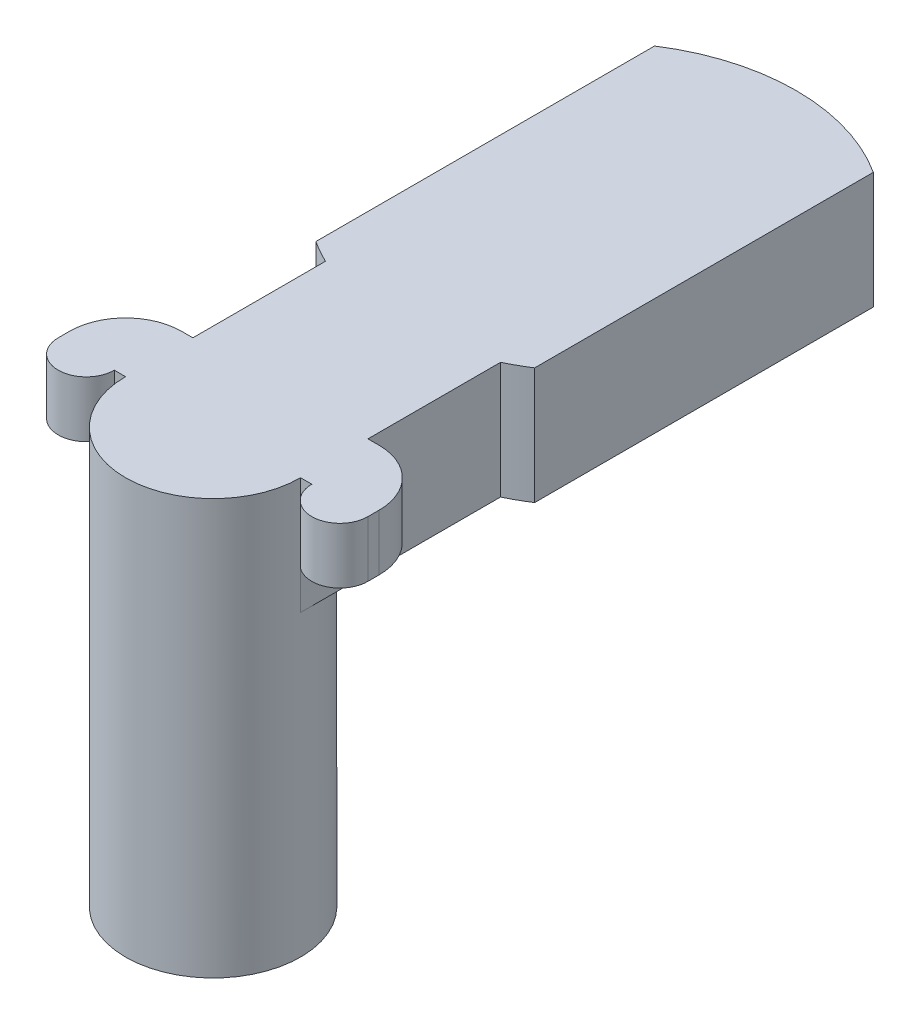
ISO-10303-21;
HEADER;
FILE_DESCRIPTION(('STEP AP214'),'2;1');
FILE_NAME('part.step','',(''),(''),'','','');
FILE_SCHEMA(('AUTOMOTIVE_DESIGN { 1 0 10303 214 1 1 1 1 }'));
ENDSEC;
DATA;
#1=APPLICATION_CONTEXT('core data for automotive mechanical design processes');
#2=APPLICATION_PROTOCOL_DEFINITION('international standard','automotive_design',2000,#1);
#3=PRODUCT_CONTEXT('',#1,'mechanical');
#4=PRODUCT('Part','Part','',(#3));
#5=PRODUCT_RELATED_PRODUCT_CATEGORY('part','',(#4));
#6=PRODUCT_DEFINITION_FORMATION('','',#4);
#7=PRODUCT_DEFINITION_CONTEXT('part definition',#1,'design');
#8=PRODUCT_DEFINITION('design','',#6,#7);
#9=PRODUCT_DEFINITION_SHAPE('','',#8);
#10=(LENGTH_UNIT() NAMED_UNIT(*) SI_UNIT(.MILLI.,.METRE.));
#11=(NAMED_UNIT(*) PLANE_ANGLE_UNIT() SI_UNIT($,.RADIAN.));
#12=(NAMED_UNIT(*) SI_UNIT($,.STERADIAN.) SOLID_ANGLE_UNIT());
#13=UNCERTAINTY_MEASURE_WITH_UNIT(LENGTH_MEASURE(1.E-05),#10,'distance_accuracy_value','');
#14=(GEOMETRIC_REPRESENTATION_CONTEXT(3) GLOBAL_UNCERTAINTY_ASSIGNED_CONTEXT((#13)) GLOBAL_UNIT_ASSIGNED_CONTEXT((#10,
#11,#12)) REPRESENTATION_CONTEXT('',''));
#15=CARTESIAN_POINT('',(0.,0.,0.));
#16=DIRECTION('',(0.,0.,1.));
#17=DIRECTION('',(1.,0.,0.));
#18=AXIS2_PLACEMENT_3D('',#15,#16,#17);
#19=CARTESIAN_POINT('',(3.9,0.,17.));
#20=DIRECTION('',(-1.,0.,0.));
#21=DIRECTION('',(0.,-1.,0.));
#22=AXIS2_PLACEMENT_3D('',#19,#20,#21);
#23=PLANE('',#22);
#24=DIRECTION('',(0.,1.,0.));
#25=VECTOR('',#24,1.);
#26=CARTESIAN_POINT('',(3.9,0.,14.000000000005));
#27=LINE('',#26,#25);
#28=CARTESIAN_POINT('',(3.9,2.7,14.000000000005));
#29=VERTEX_POINT('',#28);
#30=CARTESIAN_POINT('',(3.9,5.2,14.000000000005));
#31=VERTEX_POINT('',#30);
#32=EDGE_CURVE('E219',#29,#31,#27,.T.);
#33=ORIENTED_EDGE('',*,*,#32,.F.);
#34=DIRECTION('',(0.,0.,1.));
#35=VECTOR('',#34,1.);
#36=CARTESIAN_POINT('',(3.9,2.7,17.));
#37=LINE('',#36,#35);
#38=CARTESIAN_POINT('',(3.9,2.7,17.));
#39=VERTEX_POINT('',#38);
#40=EDGE_CURVE('E209',#29,#39,#37,.T.);
#41=ORIENTED_EDGE('',*,*,#40,.T.);
#42=DIRECTION('',(0.,1.,0.));
#43=VECTOR('',#42,1.);
#44=CARTESIAN_POINT('',(3.9,0.,17.));
#45=LINE('',#44,#43);
#46=CARTESIAN_POINT('',(3.9,0.,17.));
#47=VERTEX_POINT('',#46);
#48=EDGE_CURVE('E235',#47,#39,#45,.T.);
#49=ORIENTED_EDGE('',*,*,#48,.F.);
#50=DIRECTION('',(0.,0.,-1.));
#51=VECTOR('',#50,1.);
#52=CARTESIAN_POINT('',(3.9,0.,17.));
#53=LINE('',#52,#51);
#54=CARTESIAN_POINT('',(3.9,0.,8.09237102135974));
#55=VERTEX_POINT('',#54);
#56=EDGE_CURVE('E244',#47,#55,#53,.T.);
#57=ORIENTED_EDGE('',*,*,#56,.T.);
#58=DIRECTION('',(0.,-1.,0.));
#59=VECTOR('',#58,1.);
#60=CARTESIAN_POINT('',(3.9,5.2,8.09237102135974));
#61=LINE('',#60,#59);
#62=CARTESIAN_POINT('',(3.9,5.2,8.09237102135974));
#63=VERTEX_POINT('',#62);
#64=EDGE_CURVE('E261',#55,#63,#61,.F.);
#65=ORIENTED_EDGE('',*,*,#64,.T.);
#66=DIRECTION('',(0.,0.,-1.));
#67=VECTOR('',#66,1.);
#68=CARTESIAN_POINT('',(3.9,5.2,17.));
#69=LINE('',#68,#67);
#70=EDGE_CURVE('E69',#31,#63,#69,.T.);
#71=ORIENTED_EDGE('',*,*,#70,.F.);
#72=EDGE_LOOP('',(#33,#41,#49,#57,#65,#71));
#73=FACE_BOUND('',#72,.T.);
#74=ADVANCED_FACE('F45',(#73),#23,.F.);
#75=CARTESIAN_POINT('',(-3.9,0.,17.));
#76=DIRECTION('',(1.,0.,0.));
#77=DIRECTION('',(0.,1.,0.));
#78=AXIS2_PLACEMENT_3D('',#75,#76,#77);
#79=PLANE('',#78);
#80=DIRECTION('',(0.,-1.,0.));
#81=VECTOR('',#80,1.);
#82=CARTESIAN_POINT('',(-3.9,0.,14.000000000005));
#83=LINE('',#82,#81);
#84=CARTESIAN_POINT('',(-3.9,5.2,14.000000000005));
#85=VERTEX_POINT('',#84);
#86=CARTESIAN_POINT('',(-3.9,2.7,14.000000000005));
#87=VERTEX_POINT('',#86);
#88=EDGE_CURVE('E11',#85,#87,#83,.T.);
#89=ORIENTED_EDGE('',*,*,#88,.F.);
#90=DIRECTION('',(0.,0.,-1.));
#91=VECTOR('',#90,1.);
#92=CARTESIAN_POINT('',(-3.9,5.2,17.));
#93=LINE('',#92,#91);
#94=CARTESIAN_POINT('',(-3.9,5.2,8.09237102135974));
#95=VERTEX_POINT('',#94);
#96=EDGE_CURVE('E252',#85,#95,#93,.T.);
#97=ORIENTED_EDGE('',*,*,#96,.T.);
#98=DIRECTION('',(0.,-1.,0.));
#99=VECTOR('',#98,1.);
#100=CARTESIAN_POINT('',(-3.9,5.2,8.09237102135974));
#101=LINE('',#100,#99);
#102=CARTESIAN_POINT('',(-3.9,0.,8.09237102135974));
#103=VERTEX_POINT('',#102);
#104=EDGE_CURVE('E257',#95,#103,#101,.T.);
#105=ORIENTED_EDGE('',*,*,#104,.T.);
#106=DIRECTION('',(0.,0.,-1.));
#107=VECTOR('',#106,1.);
#108=CARTESIAN_POINT('',(-3.9,0.,17.));
#109=LINE('',#108,#107);
#110=CARTESIAN_POINT('',(-3.9,0.,17.));
#111=VERTEX_POINT('',#110);
#112=EDGE_CURVE('E248',#111,#103,#109,.T.);
#113=ORIENTED_EDGE('',*,*,#112,.F.);
#114=DIRECTION('',(0.,-1.,0.));
#115=VECTOR('',#114,1.);
#116=CARTESIAN_POINT('',(-3.9,0.,17.));
#117=LINE('',#116,#115);
#118=CARTESIAN_POINT('',(-3.9,2.7,17.));
#119=VERTEX_POINT('',#118);
#120=EDGE_CURVE('E239',#119,#111,#117,.T.);
#121=ORIENTED_EDGE('',*,*,#120,.F.);
#122=DIRECTION('',(0.,0.,-1.));
#123=VECTOR('',#122,1.);
#124=CARTESIAN_POINT('',(-3.9,2.7,17.));
#125=LINE('',#124,#123);
#126=EDGE_CURVE('E204',#119,#87,#125,.T.);
#127=ORIENTED_EDGE('',*,*,#126,.T.);
#128=EDGE_LOOP('',(#89,#97,#105,#113,#121,#127));
#129=FACE_BOUND('',#128,.T.);
#130=ADVANCED_FACE('F325',(#129),#79,.F.);
#131=CARTESIAN_POINT('',(0.,5.2,0.));
#132=DIRECTION('',(0.,-1.,0.));
#133=DIRECTION('',(0.,0.,-1.));
#134=AXIS2_PLACEMENT_3D('',#131,#132,#133);
#135=CYLINDRICAL_SURFACE('',#134,8.98312132542708);
#136=ORIENTED_EDGE('',*,*,#64,.F.);
#137=CARTESIAN_POINT('',(0.,0.,0.));
#138=DIRECTION('',(0.,1.,0.));
#139=DIRECTION('',(0.,0.,1.));
#140=AXIS2_PLACEMENT_3D('',#137,#138,#139);
#141=CIRCLE('',#140,8.98312132542708);
#142=CARTESIAN_POINT('',(4.875,0.,7.54525306052374));
#143=VERTEX_POINT('',#142);
#144=EDGE_CURVE('E289',#55,#143,#141,.T.);
#145=ORIENTED_EDGE('',*,*,#144,.T.);
#146=DIRECTION('',(0.,-1.,0.));
#147=VECTOR('',#146,1.);
#148=CARTESIAN_POINT('',(4.875,5.2,7.54525306052374));
#149=LINE('',#148,#147);
#150=CARTESIAN_POINT('',(4.875,5.2,7.54525306052374));
#151=VERTEX_POINT('',#150);
#152=EDGE_CURVE('E298',#151,#143,#149,.T.);
#153=ORIENTED_EDGE('',*,*,#152,.F.);
#154=CARTESIAN_POINT('',(0.,5.2,0.));
#155=DIRECTION('',(0.,1.,0.));
#156=DIRECTION('',(0.,0.,1.));
#157=AXIS2_PLACEMENT_3D('',#154,#155,#156);
#158=CIRCLE('',#157,8.98312132542708);
#159=EDGE_CURVE('E274',#63,#151,#158,.T.);
#160=ORIENTED_EDGE('',*,*,#159,.F.);
#161=EDGE_LOOP('',(#136,#145,#153,#160));
#162=FACE_BOUND('',#161,.T.);
#163=ADVANCED_FACE('F336',(#162),#135,.T.);
#164=ORIENTED_EDGE('',*,*,#104,.F.);
#165=CARTESIAN_POINT('',(-4.875,5.2,7.54525306052374));
#166=VERTEX_POINT('',#165);
#167=EDGE_CURVE('E275',#166,#95,#158,.T.);
#168=ORIENTED_EDGE('',*,*,#167,.F.);
#169=DIRECTION('',(0.,-1.,0.));
#170=VECTOR('',#169,1.);
#171=CARTESIAN_POINT('',(-4.875,5.2,7.54525306052374));
#172=LINE('',#171,#170);
#173=CARTESIAN_POINT('',(-4.875,0.,7.54525306052374));
#174=VERTEX_POINT('',#173);
#175=EDGE_CURVE('E302',#166,#174,#172,.T.);
#176=ORIENTED_EDGE('',*,*,#175,.T.);
#177=EDGE_CURVE('E290',#174,#103,#141,.T.);
#178=ORIENTED_EDGE('',*,*,#177,.T.);
#179=EDGE_LOOP('',(#164,#168,#176,#178));
#180=FACE_BOUND('',#179,.T.);
#181=ADVANCED_FACE('F322',(#180),#135,.T.);
#182=CARTESIAN_POINT('',(0.,5.2,0.));
#183=DIRECTION('',(0.,-1.,0.));
#184=DIRECTION('',(0.,0.,-1.));
#185=AXIS2_PLACEMENT_3D('',#182,#183,#184);
#186=CYLINDRICAL_SURFACE('',#185,8.98312132542708);
#187=CARTESIAN_POINT('',(0.,0.,0.));
#188=DIRECTION('',(0.,1.,0.));
#189=DIRECTION('',(0.,0.,1.));
#190=AXIS2_PLACEMENT_3D('',#187,#188,#189);
#191=CIRCLE('',#190,8.98312132542708);
#192=CARTESIAN_POINT('',(4.875,0.,-7.54525306052374));
#193=VERTEX_POINT('',#192);
#194=CARTESIAN_POINT('',(-4.875,0.,-7.54525306052374));
#195=VERTEX_POINT('',#194);
#196=EDGE_CURVE('E265',#193,#195,#191,.T.);
#197=ORIENTED_EDGE('',*,*,#196,.T.);
#198=DIRECTION('',(0.,-1.,0.));
#199=VECTOR('',#198,1.);
#200=CARTESIAN_POINT('',(-4.875,5.2,-7.54525306052374));
#201=LINE('',#200,#199);
#202=CARTESIAN_POINT('',(-4.875,5.2,-7.54525306052374));
#203=VERTEX_POINT('',#202);
#204=EDGE_CURVE('E54',#203,#195,#201,.T.);
#205=ORIENTED_EDGE('',*,*,#204,.F.);
#206=CARTESIAN_POINT('',(0.,5.2,0.));
#207=DIRECTION('',(0.,1.,0.));
#208=DIRECTION('',(0.,0.,1.));
#209=AXIS2_PLACEMENT_3D('',#206,#207,#208);
#210=CIRCLE('',#209,8.98312132542708);
#211=CARTESIAN_POINT('',(4.875,5.2,-7.54525306052374));
#212=VERTEX_POINT('',#211);
#213=EDGE_CURVE('E266',#212,#203,#210,.T.);
#214=ORIENTED_EDGE('',*,*,#213,.F.);
#215=DIRECTION('',(0.,-1.,0.));
#216=VECTOR('',#215,1.);
#217=CARTESIAN_POINT('',(4.875,5.2,-7.54525306052374));
#218=LINE('',#217,#216);
#219=EDGE_CURVE('E282',#212,#193,#218,.T.);
#220=ORIENTED_EDGE('',*,*,#219,.T.);
#221=EDGE_LOOP('',(#197,#205,#214,#220));
#222=FACE_BOUND('',#221,.T.);
#223=ADVANCED_FACE('F47',(#222),#186,.T.);
#224=CARTESIAN_POINT('',(-4.875,5.2,-7.54525306052374));
#225=DIRECTION('',(1.,0.,0.));
#226=DIRECTION('',(0.,0.,-1.));
#227=AXIS2_PLACEMENT_3D('',#224,#225,#226);
#228=PLANE('',#227);
#229=DIRECTION('',(0.,0.,1.));
#230=VECTOR('',#229,1.);
#231=CARTESIAN_POINT('',(-4.875,0.,-7.54525306052374));
#232=LINE('',#231,#230);
#233=EDGE_CURVE('E286',#195,#174,#232,.T.);
#234=ORIENTED_EDGE('',*,*,#233,.T.);
#235=ORIENTED_EDGE('',*,*,#175,.F.);
#236=DIRECTION('',(0.,0.,1.));
#237=VECTOR('',#236,1.);
#238=CARTESIAN_POINT('',(-4.875,5.2,-7.54525306052374));
#239=LINE('',#238,#237);
#240=EDGE_CURVE('E270',#203,#166,#239,.T.);
#241=ORIENTED_EDGE('',*,*,#240,.F.);
#242=ORIENTED_EDGE('',*,*,#204,.T.);
#243=EDGE_LOOP('',(#234,#235,#241,#242));
#244=FACE_BOUND('',#243,.T.);
#245=ADVANCED_FACE('F309',(#244),#228,.F.);
#246=CARTESIAN_POINT('',(4.875,5.2,-7.54525306052374));
#247=DIRECTION('',(-1.,0.,0.));
#248=DIRECTION('',(0.,0.,1.));
#249=AXIS2_PLACEMENT_3D('',#246,#247,#248);
#250=PLANE('',#249);
#251=DIRECTION('',(0.,0.,-1.));
#252=VECTOR('',#251,1.);
#253=CARTESIAN_POINT('',(4.875,0.,-7.54525306052374));
#254=LINE('',#253,#252);
#255=EDGE_CURVE('E271',#143,#193,#254,.T.);
#256=ORIENTED_EDGE('',*,*,#255,.T.);
#257=ORIENTED_EDGE('',*,*,#219,.F.);
#258=DIRECTION('',(0.,0.,-1.));
#259=VECTOR('',#258,1.);
#260=CARTESIAN_POINT('',(4.875,5.2,-7.54525306052374));
#261=LINE('',#260,#259);
#262=EDGE_CURVE('E279',#151,#212,#261,.T.);
#263=ORIENTED_EDGE('',*,*,#262,.F.);
#264=ORIENTED_EDGE('',*,*,#152,.T.);
#265=EDGE_LOOP('',(#256,#257,#263,#264));
#266=FACE_BOUND('',#265,.T.);
#267=ADVANCED_FACE('F333',(#266),#250,.F.);
#268=CARTESIAN_POINT('',(0.,5.2,0.));
#269=DIRECTION('',(0.,1.,0.));
#270=DIRECTION('',(0.,0.,1.));
#271=AXIS2_PLACEMENT_3D('',#268,#269,#270);
#272=PLANE('',#271);
#273=CARTESIAN_POINT('',(0.,5.2,17.));
#274=DIRECTION('',(0.,1.,0.));
#275=DIRECTION('',(0.,0.,1.));
#276=AXIS2_PLACEMENT_3D('',#273,#274,#275);
#277=CIRCLE('',#276,3.9);
#278=CARTESIAN_POINT('',(-3.9,5.2,17.));
#279=VERTEX_POINT('',#278);
#280=CARTESIAN_POINT('',(3.9,5.2,17.));
#281=VERTEX_POINT('',#280);
#282=EDGE_CURVE('E222',#279,#281,#277,.T.);
#283=ORIENTED_EDGE('',*,*,#282,.T.);
#284=DIRECTION('',(1.,0.,0.));
#285=VECTOR('',#284,1.);
#286=CARTESIAN_POINT('',(-4.4,5.2,17.));
#287=LINE('',#286,#285);
#288=CARTESIAN_POINT('',(4.4,5.2,17.));
#289=VERTEX_POINT('',#288);
#290=EDGE_CURVE('E350',#281,#289,#287,.T.);
#291=ORIENTED_EDGE('',*,*,#290,.T.);
#292=CARTESIAN_POINT('',(5.65,5.2,17.));
#293=DIRECTION('',(0.,1.,0.));
#294=DIRECTION('',(0.,0.,1.));
#295=AXIS2_PLACEMENT_3D('',#292,#293,#294);
#296=CIRCLE('',#295,1.25);
#297=CARTESIAN_POINT('',(6.9,5.2,17.));
#298=VERTEX_POINT('',#297);
#299=EDGE_CURVE('E363',#289,#298,#296,.T.);
#300=ORIENTED_EDGE('',*,*,#299,.T.);
#301=DIRECTION('',(0.,0.,1.));
#302=VECTOR('',#301,1.);
#303=CARTESIAN_POINT('',(6.9,5.2,16.500000000005));
#304=LINE('',#303,#302);
#305=CARTESIAN_POINT('',(6.9,5.2,16.500000000005));
#306=VERTEX_POINT('',#305);
#307=EDGE_CURVE('E392',#306,#298,#304,.T.);
#308=ORIENTED_EDGE('',*,*,#307,.F.);
#309=CARTESIAN_POINT('',(4.4,5.2,16.500000000005));
#310=DIRECTION('',(0.,-1.,0.));
#311=DIRECTION('',(0.,0.,-1.));
#312=AXIS2_PLACEMENT_3D('',#309,#310,#311);
#313=CIRCLE('',#312,2.5);
#314=CARTESIAN_POINT('',(4.4,5.2,14.000000000005));
#315=VERTEX_POINT('',#314);
#316=EDGE_CURVE('E397',#315,#306,#313,.T.);
#317=ORIENTED_EDGE('',*,*,#316,.F.);
#318=DIRECTION('',(1.,0.,0.));
#319=VECTOR('',#318,1.);
#320=CARTESIAN_POINT('',(-4.4,5.2,14.000000000005));
#321=LINE('',#320,#319);
#322=EDGE_CURVE('E406',#31,#315,#321,.T.);
#323=ORIENTED_EDGE('',*,*,#322,.F.);
#324=ORIENTED_EDGE('',*,*,#70,.T.);
#325=ORIENTED_EDGE('',*,*,#159,.T.);
#326=ORIENTED_EDGE('',*,*,#262,.T.);
#327=ORIENTED_EDGE('',*,*,#213,.T.);
#328=ORIENTED_EDGE('',*,*,#240,.T.);
#329=ORIENTED_EDGE('',*,*,#167,.T.);
#330=ORIENTED_EDGE('',*,*,#96,.F.);
#331=CARTESIAN_POINT('',(-4.4,5.2,14.000000000005));
#332=VERTEX_POINT('',#331);
#333=EDGE_CURVE('E329',#332,#85,#321,.T.);
#334=ORIENTED_EDGE('',*,*,#333,.F.);
#335=CARTESIAN_POINT('',(-4.4,5.2,16.500000000005));
#336=DIRECTION('',(0.,-1.,0.));
#337=DIRECTION('',(0.,0.,-1.));
#338=AXIS2_PLACEMENT_3D('',#335,#336,#337);
#339=CIRCLE('',#338,2.5);
#340=CARTESIAN_POINT('',(-6.9,5.2,16.500000000005));
#341=VERTEX_POINT('',#340);
#342=EDGE_CURVE('E202',#341,#332,#339,.T.);
#343=ORIENTED_EDGE('',*,*,#342,.F.);
#344=DIRECTION('',(0.,0.,1.));
#345=VECTOR('',#344,1.);
#346=CARTESIAN_POINT('',(-6.9,5.2,16.500000000005));
#347=LINE('',#346,#345);
#348=CARTESIAN_POINT('',(-6.9,5.2,17.));
#349=VERTEX_POINT('',#348);
#350=EDGE_CURVE('E198',#341,#349,#347,.T.);
#351=ORIENTED_EDGE('',*,*,#350,.T.);
#352=CARTESIAN_POINT('',(-5.65,5.2,17.));
#353=DIRECTION('',(0.,-1.,0.));
#354=DIRECTION('',(0.,0.,-1.));
#355=AXIS2_PLACEMENT_3D('',#352,#353,#354);
#356=CIRCLE('',#355,1.25);
#357=CARTESIAN_POINT('',(-4.4,5.2,17.));
#358=VERTEX_POINT('',#357);
#359=EDGE_CURVE('E357',#358,#349,#356,.T.);
#360=ORIENTED_EDGE('',*,*,#359,.F.);
#361=EDGE_CURVE('E354',#358,#279,#287,.T.);
#362=ORIENTED_EDGE('',*,*,#361,.T.);
#363=EDGE_LOOP('',(#283,#291,#300,#308,#317,#323,#324,#325,#326,#327,#328,#329,#330,#334,#343,
#351,#360,#362));
#364=FACE_BOUND('',#363,.T.);
#365=ADVANCED_FACE('F328',(#364),#272,.T.);
#366=CARTESIAN_POINT('',(0.,0.,0.));
#367=DIRECTION('',(0.,1.,0.));
#368=DIRECTION('',(0.,0.,1.));
#369=AXIS2_PLACEMENT_3D('',#366,#367,#368);
#370=PLANE('',#369);
#371=ORIENTED_EDGE('',*,*,#56,.F.);
#372=CARTESIAN_POINT('',(0.,0.,17.));
#373=DIRECTION('',(0.,1.,0.));
#374=DIRECTION('',(0.,0.,1.));
#375=AXIS2_PLACEMENT_3D('',#372,#373,#374);
#376=CIRCLE('',#375,3.9);
#377=EDGE_CURVE('E227',#47,#111,#376,.T.);
#378=ORIENTED_EDGE('',*,*,#377,.T.);
#379=ORIENTED_EDGE('',*,*,#112,.T.);
#380=ORIENTED_EDGE('',*,*,#177,.F.);
#381=ORIENTED_EDGE('',*,*,#233,.F.);
#382=ORIENTED_EDGE('',*,*,#196,.F.);
#383=ORIENTED_EDGE('',*,*,#255,.F.);
#384=ORIENTED_EDGE('',*,*,#144,.F.);
#385=EDGE_LOOP('',(#371,#378,#379,#380,#381,#382,#383,#384));
#386=FACE_BOUND('',#385,.T.);
#387=ADVANCED_FACE('F317',(#386),#370,.F.);
#388=CARTESIAN_POINT('',(0.,-13.3,17.));
#389=DIRECTION('',(0.,1.,0.));
#390=DIRECTION('',(0.,0.,1.));
#391=AXIS2_PLACEMENT_3D('',#388,#389,#390);
#392=CYLINDRICAL_SURFACE('',#391,3.9);
#393=CARTESIAN_POINT('',(0.,-13.3,17.));
#394=DIRECTION('',(0.,1.,0.));
#395=DIRECTION('',(0.,0.,1.));
#396=AXIS2_PLACEMENT_3D('',#393,#394,#395);
#397=CIRCLE('',#396,3.9);
#398=CARTESIAN_POINT('',(0.,-13.3,20.9));
#399=VERTEX_POINT('',#398);
#400=EDGE_CURVE('E223',#399,#399,#397,.T.);
#401=ORIENTED_EDGE('',*,*,#400,.T.);
#402=EDGE_LOOP('',(#401));
#403=FACE_BOUND('',#402,.T.);
#404=EDGE_CURVE('E240',#279,#119,#117,.T.);
#405=ORIENTED_EDGE('',*,*,#404,.T.);
#406=ORIENTED_EDGE('',*,*,#120,.T.);
#407=ORIENTED_EDGE('',*,*,#377,.F.);
#408=ORIENTED_EDGE('',*,*,#48,.T.);
#409=EDGE_CURVE('E234',#39,#281,#45,.T.);
#410=ORIENTED_EDGE('',*,*,#409,.T.);
#411=ORIENTED_EDGE('',*,*,#282,.F.);
#412=EDGE_LOOP('',(#405,#406,#407,#408,#410,#411));
#413=FACE_BOUND('',#412,.T.);
#414=ADVANCED_FACE('F343',(#403,#413),#392,.T.);
#415=CARTESIAN_POINT('',(0.,-13.3,17.));
#416=DIRECTION('',(0.,1.,0.));
#417=DIRECTION('',(0.,0.,1.));
#418=AXIS2_PLACEMENT_3D('',#415,#416,#417);
#419=PLANE('',#418);
#420=CARTESIAN_POINT('',(0.,-13.3,17.));
#421=DIRECTION('',(0.,-1.,0.));
#422=DIRECTION('',(0.,0.,-1.));
#423=AXIS2_PLACEMENT_3D('',#420,#421,#422);
#424=CIRCLE('',#423,1.6);
#425=CARTESIAN_POINT('',(0.,-13.3,15.4));
#426=VERTEX_POINT('',#425);
#427=EDGE_CURVE('E426',#426,#426,#424,.T.);
#428=ORIENTED_EDGE('',*,*,#427,.F.);
#429=EDGE_LOOP('',(#428));
#430=FACE_BOUND('',#429,.T.);
#431=ORIENTED_EDGE('',*,*,#400,.F.);
#432=EDGE_LOOP('',(#431));
#433=FACE_BOUND('',#432,.T.);
#434=ADVANCED_FACE('F443',(#430,#433),#419,.F.);
#435=CARTESIAN_POINT('',(-6.9,2.7,16.500000000005));
#436=DIRECTION('',(-1.,0.,0.));
#437=DIRECTION('',(0.,0.,1.));
#438=AXIS2_PLACEMENT_3D('',#435,#436,#437);
#439=PLANE('',#438);
#440=ORIENTED_EDGE('',*,*,#350,.F.);
#441=DIRECTION('',(0.,1.,0.));
#442=VECTOR('',#441,1.);
#443=CARTESIAN_POINT('',(-6.9,2.7,16.500000000005));
#444=LINE('',#443,#442);
#445=CARTESIAN_POINT('',(-6.9,2.7,16.500000000005));
#446=VERTEX_POINT('',#445);
#447=EDGE_CURVE('E369',#446,#341,#444,.T.);
#448=ORIENTED_EDGE('',*,*,#447,.F.);
#449=DIRECTION('',(0.,0.,1.));
#450=VECTOR('',#449,1.);
#451=CARTESIAN_POINT('',(-6.9,2.7,16.500000000005));
#452=LINE('',#451,#450);
#453=CARTESIAN_POINT('',(-6.9,2.7,17.));
#454=VERTEX_POINT('',#453);
#455=EDGE_CURVE('E195',#446,#454,#452,.T.);
#456=ORIENTED_EDGE('',*,*,#455,.T.);
#457=DIRECTION('',(0.,1.,0.));
#458=VECTOR('',#457,1.);
#459=CARTESIAN_POINT('',(-6.9,2.7,17.));
#460=LINE('',#459,#458);
#461=EDGE_CURVE('E372',#454,#349,#460,.T.);
#462=ORIENTED_EDGE('',*,*,#461,.T.);
#463=EDGE_LOOP('',(#440,#448,#456,#462));
#464=FACE_BOUND('',#463,.T.);
#465=ADVANCED_FACE('F446',(#464),#439,.T.);
#466=CARTESIAN_POINT('',(-4.4,2.7,16.500000000005));
#467=DIRECTION('',(0.,1.,0.));
#468=DIRECTION('',(0.,0.,1.));
#469=AXIS2_PLACEMENT_3D('',#466,#467,#468);
#470=CYLINDRICAL_SURFACE('',#469,2.5);
#471=ORIENTED_EDGE('',*,*,#342,.T.);
#472=DIRECTION('',(0.,1.,0.));
#473=VECTOR('',#472,1.);
#474=CARTESIAN_POINT('',(-4.4,2.7,14.000000000005));
#475=LINE('',#474,#473);
#476=CARTESIAN_POINT('',(-4.4,2.7,14.000000000005));
#477=VERTEX_POINT('',#476);
#478=EDGE_CURVE('E181',#477,#332,#475,.T.);
#479=ORIENTED_EDGE('',*,*,#478,.F.);
#480=CARTESIAN_POINT('',(-4.4,2.7,16.500000000005));
#481=DIRECTION('',(0.,-1.,0.));
#482=DIRECTION('',(0.,0.,-1.));
#483=AXIS2_PLACEMENT_3D('',#480,#481,#482);
#484=CIRCLE('',#483,2.5);
#485=EDGE_CURVE('E192',#446,#477,#484,.T.);
#486=ORIENTED_EDGE('',*,*,#485,.F.);
#487=ORIENTED_EDGE('',*,*,#447,.T.);
#488=EDGE_LOOP('',(#471,#479,#486,#487));
#489=FACE_BOUND('',#488,.T.);
#490=ADVANCED_FACE('F200',(#489),#470,.T.);
#491=CARTESIAN_POINT('',(-5.65,2.7,17.));
#492=DIRECTION('',(0.,1.,0.));
#493=DIRECTION('',(0.,0.,1.));
#494=AXIS2_PLACEMENT_3D('',#491,#492,#493);
#495=CYLINDRICAL_SURFACE('',#494,1.25);
#496=ORIENTED_EDGE('',*,*,#359,.T.);
#497=ORIENTED_EDGE('',*,*,#461,.F.);
#498=CARTESIAN_POINT('',(-5.65,2.7,17.));
#499=DIRECTION('',(0.,-1.,0.));
#500=DIRECTION('',(0.,0.,-1.));
#501=AXIS2_PLACEMENT_3D('',#498,#499,#500);
#502=CIRCLE('',#501,1.25);
#503=CARTESIAN_POINT('',(-4.4,2.7,17.));
#504=VERTEX_POINT('',#503);
#505=EDGE_CURVE('E412',#504,#454,#502,.T.);
#506=ORIENTED_EDGE('',*,*,#505,.F.);
#507=DIRECTION('',(0.,1.,0.));
#508=VECTOR('',#507,1.);
#509=CARTESIAN_POINT('',(-4.4,2.7,17.));
#510=LINE('',#509,#508);
#511=EDGE_CURVE('E375',#504,#358,#510,.T.);
#512=ORIENTED_EDGE('',*,*,#511,.T.);
#513=EDGE_LOOP('',(#496,#497,#506,#512));
#514=FACE_BOUND('',#513,.T.);
#515=ADVANCED_FACE('F535',(#514),#495,.T.);
#516=CARTESIAN_POINT('',(-4.4,2.7,17.));
#517=DIRECTION('',(0.,0.,1.));
#518=DIRECTION('',(1.,0.,0.));
#519=AXIS2_PLACEMENT_3D('',#516,#517,#518);
#520=PLANE('',#519);
#521=DIRECTION('',(1.,0.,0.));
#522=VECTOR('',#521,1.);
#523=CARTESIAN_POINT('',(-4.4,2.7,17.));
#524=LINE('',#523,#522);
#525=EDGE_CURVE('E61',#504,#119,#524,.T.);
#526=ORIENTED_EDGE('',*,*,#525,.T.);
#527=ORIENTED_EDGE('',*,*,#404,.F.);
#528=ORIENTED_EDGE('',*,*,#361,.F.);
#529=ORIENTED_EDGE('',*,*,#511,.F.);
#530=EDGE_LOOP('',(#526,#527,#528,#529));
#531=FACE_BOUND('',#530,.T.);
#532=ADVANCED_FACE('F543',(#531),#520,.T.);
#533=CARTESIAN_POINT('',(-4.4,2.7,16.500000000005));
#534=DIRECTION('',(0.,-1.,0.));
#535=DIRECTION('',(0.,0.,-1.));
#536=AXIS2_PLACEMENT_3D('',#533,#534,#535);
#537=PLANE('',#536);
#538=ORIENTED_EDGE('',*,*,#126,.F.);
#539=ORIENTED_EDGE('',*,*,#525,.F.);
#540=ORIENTED_EDGE('',*,*,#505,.T.);
#541=ORIENTED_EDGE('',*,*,#455,.F.);
#542=ORIENTED_EDGE('',*,*,#485,.T.);
#543=DIRECTION('',(1.,0.,0.));
#544=VECTOR('',#543,1.);
#545=CARTESIAN_POINT('',(-4.4,2.7,14.000000000005));
#546=LINE('',#545,#544);
#547=EDGE_CURVE('E177',#477,#87,#546,.T.);
#548=ORIENTED_EDGE('',*,*,#547,.T.);
#549=EDGE_LOOP('',(#538,#539,#540,#541,#542,#548));
#550=FACE_BOUND('',#549,.T.);
#551=ADVANCED_FACE('F193',(#550),#537,.T.);
#552=CARTESIAN_POINT('',(-4.4,2.7,14.000000000005));
#553=DIRECTION('',(0.,0.,1.));
#554=DIRECTION('',(1.,0.,0.));
#555=AXIS2_PLACEMENT_3D('',#552,#553,#554);
#556=PLANE('',#555);
#557=ORIENTED_EDGE('',*,*,#333,.T.);
#558=ORIENTED_EDGE('',*,*,#88,.T.);
#559=ORIENTED_EDGE('',*,*,#547,.F.);
#560=ORIENTED_EDGE('',*,*,#478,.T.);
#561=EDGE_LOOP('',(#557,#558,#559,#560));
#562=FACE_BOUND('',#561,.T.);
#563=ADVANCED_FACE('F179',(#562),#556,.F.);
#564=CARTESIAN_POINT('',(4.4,2.7,14.000000000005));
#565=VERTEX_POINT('',#564);
#566=EDGE_CURVE('E188',#29,#565,#546,.T.);
#567=ORIENTED_EDGE('',*,*,#566,.F.);
#568=ORIENTED_EDGE('',*,*,#32,.T.);
#569=ORIENTED_EDGE('',*,*,#322,.T.);
#570=DIRECTION('',(0.,1.,0.));
#571=VECTOR('',#570,1.);
#572=CARTESIAN_POINT('',(4.4,2.7,14.000000000005));
#573=LINE('',#572,#571);
#574=EDGE_CURVE('E205',#565,#315,#573,.T.);
#575=ORIENTED_EDGE('',*,*,#574,.F.);
#576=EDGE_LOOP('',(#567,#568,#569,#575));
#577=FACE_BOUND('',#576,.T.);
#578=ADVANCED_FACE('F568',(#577),#556,.F.);
#579=ORIENTED_EDGE('',*,*,#290,.F.);
#580=ORIENTED_EDGE('',*,*,#409,.F.);
#581=CARTESIAN_POINT('',(4.4,2.7,17.));
#582=VERTEX_POINT('',#581);
#583=EDGE_CURVE('E417',#39,#582,#524,.T.);
#584=ORIENTED_EDGE('',*,*,#583,.T.);
#585=DIRECTION('',(0.,1.,0.));
#586=VECTOR('',#585,1.);
#587=CARTESIAN_POINT('',(4.4,2.7,17.));
#588=LINE('',#587,#586);
#589=EDGE_CURVE('E378',#582,#289,#588,.T.);
#590=ORIENTED_EDGE('',*,*,#589,.T.);
#591=EDGE_LOOP('',(#579,#580,#584,#590));
#592=FACE_BOUND('',#591,.T.);
#593=ADVANCED_FACE('F553',(#592),#520,.T.);
#594=ORIENTED_EDGE('',*,*,#40,.F.);
#595=ORIENTED_EDGE('',*,*,#566,.T.);
#596=CARTESIAN_POINT('',(4.4,2.7,16.500000000005));
#597=DIRECTION('',(0.,-1.,0.));
#598=DIRECTION('',(0.,0.,-1.));
#599=AXIS2_PLACEMENT_3D('',#596,#597,#598);
#600=CIRCLE('',#599,2.5);
#601=CARTESIAN_POINT('',(6.9,2.7,16.500000000005));
#602=VERTEX_POINT('',#601);
#603=EDGE_CURVE('E187',#565,#602,#600,.T.);
#604=ORIENTED_EDGE('',*,*,#603,.T.);
#605=DIRECTION('',(0.,0.,1.));
#606=VECTOR('',#605,1.);
#607=CARTESIAN_POINT('',(6.9,2.7,16.500000000005));
#608=LINE('',#607,#606);
#609=CARTESIAN_POINT('',(6.9,2.7,17.));
#610=VERTEX_POINT('',#609);
#611=EDGE_CURVE('E393',#602,#610,#608,.T.);
#612=ORIENTED_EDGE('',*,*,#611,.T.);
#613=CARTESIAN_POINT('',(5.65,2.7,17.));
#614=DIRECTION('',(0.,1.,0.));
#615=DIRECTION('',(0.,0.,1.));
#616=AXIS2_PLACEMENT_3D('',#613,#614,#615);
#617=CIRCLE('',#616,1.25);
#618=EDGE_CURVE('E418',#582,#610,#617,.T.);
#619=ORIENTED_EDGE('',*,*,#618,.F.);
#620=ORIENTED_EDGE('',*,*,#583,.F.);
#621=EDGE_LOOP('',(#594,#595,#604,#612,#619,#620));
#622=FACE_BOUND('',#621,.T.);
#623=ADVANCED_FACE('F561',(#622),#537,.T.);
#624=CARTESIAN_POINT('',(4.4,2.7,16.500000000005));
#625=DIRECTION('',(0.,1.,0.));
#626=DIRECTION('',(0.,0.,1.));
#627=AXIS2_PLACEMENT_3D('',#624,#625,#626);
#628=CYLINDRICAL_SURFACE('',#627,2.5);
#629=ORIENTED_EDGE('',*,*,#316,.T.);
#630=DIRECTION('',(0.,1.,0.));
#631=VECTOR('',#630,1.);
#632=CARTESIAN_POINT('',(6.9,2.7,16.500000000005));
#633=LINE('',#632,#631);
#634=EDGE_CURVE('E212',#602,#306,#633,.T.);
#635=ORIENTED_EDGE('',*,*,#634,.F.);
#636=ORIENTED_EDGE('',*,*,#603,.F.);
#637=ORIENTED_EDGE('',*,*,#574,.T.);
#638=EDGE_LOOP('',(#629,#635,#636,#637));
#639=FACE_BOUND('',#638,.T.);
#640=ADVANCED_FACE('F589',(#639),#628,.T.);
#641=CARTESIAN_POINT('',(6.9,2.7,16.500000000005));
#642=DIRECTION('',(-1.,0.,0.));
#643=DIRECTION('',(0.,0.,1.));
#644=AXIS2_PLACEMENT_3D('',#641,#642,#643);
#645=PLANE('',#644);
#646=ORIENTED_EDGE('',*,*,#307,.T.);
#647=DIRECTION('',(0.,1.,0.));
#648=VECTOR('',#647,1.);
#649=CARTESIAN_POINT('',(6.9,2.7,17.));
#650=LINE('',#649,#648);
#651=EDGE_CURVE('E381',#610,#298,#650,.T.);
#652=ORIENTED_EDGE('',*,*,#651,.F.);
#653=ORIENTED_EDGE('',*,*,#611,.F.);
#654=ORIENTED_EDGE('',*,*,#634,.T.);
#655=EDGE_LOOP('',(#646,#652,#653,#654));
#656=FACE_BOUND('',#655,.T.);
#657=ADVANCED_FACE('F390',(#656),#645,.F.);
#658=CARTESIAN_POINT('',(5.65,2.7,17.));
#659=DIRECTION('',(0.,1.,0.));
#660=DIRECTION('',(0.,0.,1.));
#661=AXIS2_PLACEMENT_3D('',#658,#659,#660);
#662=CYLINDRICAL_SURFACE('',#661,1.25);
#663=ORIENTED_EDGE('',*,*,#299,.F.);
#664=ORIENTED_EDGE('',*,*,#589,.F.);
#665=ORIENTED_EDGE('',*,*,#618,.T.);
#666=ORIENTED_EDGE('',*,*,#651,.T.);
#667=EDGE_LOOP('',(#663,#664,#665,#666));
#668=FACE_BOUND('',#667,.T.);
#669=ADVANCED_FACE('F439',(#668),#662,.T.);
#670=CARTESIAN_POINT('',(0.,-8.3,17.));
#671=DIRECTION('',(0.,-1.,0.));
#672=DIRECTION('',(0.,0.,-1.));
#673=AXIS2_PLACEMENT_3D('',#670,#671,#672);
#674=CYLINDRICAL_SURFACE('',#673,1.6);
#675=CARTESIAN_POINT('',(0.,-8.3,17.));
#676=DIRECTION('',(0.,-1.,0.));
#677=DIRECTION('',(0.,0.,-1.));
#678=AXIS2_PLACEMENT_3D('',#675,#676,#677);
#679=CIRCLE('',#678,1.6);
#680=CARTESIAN_POINT('',(0.,-8.3,15.4));
#681=VERTEX_POINT('',#680);
#682=EDGE_CURVE('E409',#681,#681,#679,.T.);
#683=ORIENTED_EDGE('',*,*,#682,.F.);
#684=EDGE_LOOP('',(#683));
#685=FACE_BOUND('',#684,.T.);
#686=ORIENTED_EDGE('',*,*,#427,.T.);
#687=EDGE_LOOP('',(#686));
#688=FACE_BOUND('',#687,.T.);
#689=ADVANCED_FACE('F436',(#685,#688),#674,.F.);
#690=CARTESIAN_POINT('',(0.,-8.3,17.));
#691=DIRECTION('',(0.,-1.,0.));
#692=DIRECTION('',(0.,0.,-1.));
#693=AXIS2_PLACEMENT_3D('',#690,#691,#692);
#694=PLANE('',#693);
#695=ORIENTED_EDGE('',*,*,#682,.T.);
#696=EDGE_LOOP('',(#695));
#697=FACE_BOUND('',#696,.T.);
#698=ADVANCED_FACE('F434',(#697),#694,.T.);
#699=CLOSED_SHELL('',(#74,#130,#163,#181,#223,#245,#267,#365,#387,#414,#434,#465,#490,#515,#532,
#551,#563,#578,#593,#623,#640,#657,#669,#689,#698));
#700=MANIFOLD_SOLID_BREP('B2',#699);
#701=ADVANCED_BREP_SHAPE_REPRESENTATION('',(#18,#700),#14);
#702=SHAPE_DEFINITION_REPRESENTATION(#9,#701);
ENDSEC;
END-ISO-10303-21;
